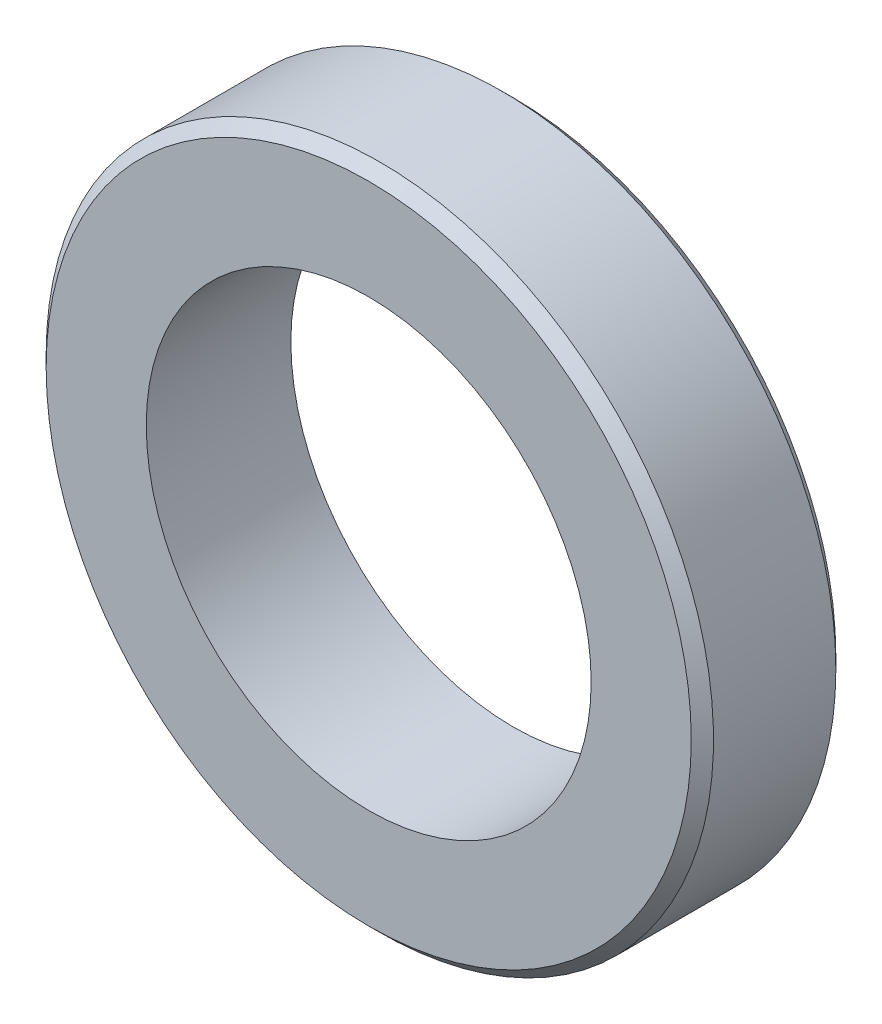
ISO-10303-21;
HEADER;
FILE_DESCRIPTION(('STEP AP214'),'2;1');
FILE_NAME('part.step','',(''),(''),'','','');
FILE_SCHEMA(('AUTOMOTIVE_DESIGN { 1 0 10303 214 1 1 1 1 }'));
ENDSEC;
DATA;
#1=APPLICATION_CONTEXT('core data for automotive mechanical design processes');
#2=APPLICATION_PROTOCOL_DEFINITION('international standard','automotive_design',2000,#1);
#3=PRODUCT_CONTEXT('',#1,'mechanical');
#4=PRODUCT('Part','Part','',(#3));
#5=PRODUCT_RELATED_PRODUCT_CATEGORY('part','',(#4));
#6=PRODUCT_DEFINITION_FORMATION('','',#4);
#7=PRODUCT_DEFINITION_CONTEXT('part definition',#1,'design');
#8=PRODUCT_DEFINITION('design','',#6,#7);
#9=PRODUCT_DEFINITION_SHAPE('','',#8);
#10=(LENGTH_UNIT() NAMED_UNIT(*) SI_UNIT(.MILLI.,.METRE.));
#11=(NAMED_UNIT(*) PLANE_ANGLE_UNIT() SI_UNIT($,.RADIAN.));
#12=(NAMED_UNIT(*) SI_UNIT($,.STERADIAN.) SOLID_ANGLE_UNIT());
#13=UNCERTAINTY_MEASURE_WITH_UNIT(LENGTH_MEASURE(1.E-05),#10,'distance_accuracy_value','');
#14=(GEOMETRIC_REPRESENTATION_CONTEXT(3) GLOBAL_UNCERTAINTY_ASSIGNED_CONTEXT((#13)) GLOBAL_UNIT_ASSIGNED_CONTEXT((#10,
#11,#12)) REPRESENTATION_CONTEXT('',''));
#15=CARTESIAN_POINT('',(0.,0.,0.));
#16=DIRECTION('',(0.,0.,1.));
#17=DIRECTION('',(1.,0.,0.));
#18=AXIS2_PLACEMENT_3D('',#15,#16,#17);
#19=CARTESIAN_POINT('',(0.,0.,13.));
#20=DIRECTION('',(0.,0.,1.));
#21=DIRECTION('',(1.,0.,0.));
#22=AXIS2_PLACEMENT_3D('',#19,#20,#21);
#23=PLANE('',#22);
#24=CARTESIAN_POINT('',(0.,0.,13.));
#25=DIRECTION('',(0.,0.,1.));
#26=DIRECTION('',(1.,0.,0.));
#27=AXIS2_PLACEMENT_3D('',#24,#25,#26);
#28=CIRCLE('',#27,29.);
#29=CARTESIAN_POINT('',(29.,0.,13.));
#30=VERTEX_POINT('',#29);
#31=EDGE_CURVE('E55',#30,#30,#28,.T.);
#32=ORIENTED_EDGE('',*,*,#31,.T.);
#33=EDGE_LOOP('',(#32));
#34=FACE_BOUND('',#33,.T.);
#35=CARTESIAN_POINT('',(0.,0.,13.));
#36=DIRECTION('',(0.,0.,1.));
#37=DIRECTION('',(1.,0.,0.));
#38=AXIS2_PLACEMENT_3D('',#35,#36,#37);
#39=CIRCLE('',#38,20.);
#40=CARTESIAN_POINT('',(-20.,0.,13.));
#41=VERTEX_POINT('',#40);
#42=EDGE_CURVE('E60',#41,#41,#39,.T.);
#43=ORIENTED_EDGE('',*,*,#42,.F.);
#44=EDGE_LOOP('',(#43));
#45=FACE_BOUND('',#44,.T.);
#46=ADVANCED_FACE('F39',(#34,#45),#23,.T.);
#47=CARTESIAN_POINT('',(0.,0.,0.));
#48=DIRECTION('',(0.,0.,1.));
#49=DIRECTION('',(1.,0.,0.));
#50=AXIS2_PLACEMENT_3D('',#47,#48,#49);
#51=PLANE('',#50);
#52=CARTESIAN_POINT('',(0.,0.,0.));
#53=DIRECTION('',(0.,0.,1.));
#54=DIRECTION('',(1.,0.,0.));
#55=AXIS2_PLACEMENT_3D('',#52,#53,#54);
#56=CIRCLE('',#55,29.);
#57=CARTESIAN_POINT('',(29.,0.,0.));
#58=VERTEX_POINT('',#57);
#59=EDGE_CURVE('E10',#58,#58,#56,.F.);
#60=ORIENTED_EDGE('',*,*,#59,.T.);
#61=EDGE_LOOP('',(#60));
#62=FACE_BOUND('',#61,.T.);
#63=CARTESIAN_POINT('',(0.,0.,0.));
#64=DIRECTION('',(0.,0.,1.));
#65=DIRECTION('',(1.,0.,0.));
#66=AXIS2_PLACEMENT_3D('',#63,#64,#65);
#67=CIRCLE('',#66,20.);
#68=CARTESIAN_POINT('',(-20.,0.,0.));
#69=VERTEX_POINT('',#68);
#70=EDGE_CURVE('E61',#69,#69,#67,.T.);
#71=ORIENTED_EDGE('',*,*,#70,.T.);
#72=EDGE_LOOP('',(#71));
#73=FACE_BOUND('',#72,.T.);
#74=ADVANCED_FACE('F71',(#62,#73),#51,.F.);
#75=CARTESIAN_POINT('',(0.,0.,13.));
#76=DIRECTION('',(0.,0.,-1.));
#77=DIRECTION('',(-1.,0.,0.));
#78=AXIS2_PLACEMENT_3D('',#75,#76,#77);
#79=CYLINDRICAL_SURFACE('',#78,30.);
#80=CARTESIAN_POINT('',(0.,0.,12.));
#81=DIRECTION('',(0.,0.,1.));
#82=DIRECTION('',(1.,0.,0.));
#83=AXIS2_PLACEMENT_3D('',#80,#81,#82);
#84=CIRCLE('',#83,30.);
#85=CARTESIAN_POINT('',(-30.,0.,12.));
#86=VERTEX_POINT('',#85);
#87=EDGE_CURVE('E47',#86,#86,#84,.F.);
#88=CARTESIAN_POINT('',(0.,0.,1.00000000000003));
#89=DIRECTION('',(0.,0.,1.));
#90=DIRECTION('',(1.,0.,0.));
#91=AXIS2_PLACEMENT_3D('',#88,#89,#90);
#92=CIRCLE('',#91,30.);
#93=CARTESIAN_POINT('',(-30.,0.,1.00000000000003));
#94=VERTEX_POINT('',#93);
#95=EDGE_CURVE('E51',#94,#94,#92,.T.);
#96=CARTESIAN_POINT('',(-30.,0.,12.));
#97=CARTESIAN_POINT('',(-30.,0.,11.8854166666667));
#98=CARTESIAN_POINT('',(-30.,0.,11.7708333333334));
#99=CARTESIAN_POINT('',(-30.,0.,11.5416666666667));
#100=CARTESIAN_POINT('',(-30.,0.,11.4270833333334));
#101=CARTESIAN_POINT('',(-30.,0.,11.1979166666667));
#102=CARTESIAN_POINT('',(-30.,0.,11.0833333333334));
#103=CARTESIAN_POINT('',(-30.,0.,10.8541666666667));
#104=CARTESIAN_POINT('',(-30.,0.,10.7395833333334));
#105=CARTESIAN_POINT('',(-30.,0.,10.5104166666667));
#106=CARTESIAN_POINT('',(-30.,0.,10.3958333333334));
#107=CARTESIAN_POINT('',(-30.,0.,10.1666666666667));
#108=CARTESIAN_POINT('',(-30.,0.,10.0520833333334));
#109=CARTESIAN_POINT('',(-30.,0.,9.8229166666667));
#110=CARTESIAN_POINT('',(-30.,0.,9.70833333333336));
#111=CARTESIAN_POINT('',(-30.,0.,9.4791666666667));
#112=CARTESIAN_POINT('',(-30.,0.,9.36458333333336));
#113=CARTESIAN_POINT('',(-30.,0.,9.1354166666667));
#114=CARTESIAN_POINT('',(-30.,0.,9.02083333333336));
#115=CARTESIAN_POINT('',(-30.,0.,8.7916666666667));
#116=CARTESIAN_POINT('',(-30.,0.,8.67708333333336));
#117=CARTESIAN_POINT('',(-30.,0.,8.4479166666667));
#118=CARTESIAN_POINT('',(-30.,0.,8.33333333333336));
#119=CARTESIAN_POINT('',(-30.,0.,8.1041666666667));
#120=CARTESIAN_POINT('',(-30.,0.,7.98958333333336));
#121=CARTESIAN_POINT('',(-30.,0.,7.7604166666667));
#122=CARTESIAN_POINT('',(-30.,0.,7.64583333333336));
#123=CARTESIAN_POINT('',(-30.,0.,7.4166666666667));
#124=CARTESIAN_POINT('',(-30.,0.,7.30208333333336));
#125=CARTESIAN_POINT('',(-30.,0.,7.0729166666667));
#126=CARTESIAN_POINT('',(-30.,0.,6.95833333333336));
#127=CARTESIAN_POINT('',(-30.,0.,6.72916666666669));
#128=CARTESIAN_POINT('',(-30.,0.,6.61458333333336));
#129=CARTESIAN_POINT('',(-30.,0.,6.38541666666669));
#130=CARTESIAN_POINT('',(-30.,0.,6.27083333333336));
#131=CARTESIAN_POINT('',(-30.,0.,6.04166666666669));
#132=CARTESIAN_POINT('',(-30.,0.,5.92708333333336));
#133=CARTESIAN_POINT('',(-30.,0.,5.69791666666669));
#134=CARTESIAN_POINT('',(-30.,0.,5.58333333333336));
#135=CARTESIAN_POINT('',(-30.,0.,5.35416666666669));
#136=CARTESIAN_POINT('',(-30.,0.,5.23958333333336));
#137=CARTESIAN_POINT('',(-30.,0.,5.0104166666667));
#138=CARTESIAN_POINT('',(-30.,0.,4.89583333333336));
#139=CARTESIAN_POINT('',(-30.,0.,4.66666666666669));
#140=CARTESIAN_POINT('',(-30.,0.,4.55208333333336));
#141=CARTESIAN_POINT('',(-30.,0.,4.32291666666669));
#142=CARTESIAN_POINT('',(-30.,0.,4.20833333333336));
#143=CARTESIAN_POINT('',(-30.,0.,3.97916666666669));
#144=CARTESIAN_POINT('',(-30.,0.,3.86458333333336));
#145=CARTESIAN_POINT('',(-30.,0.,3.63541666666669));
#146=CARTESIAN_POINT('',(-30.,0.,3.52083333333336));
#147=CARTESIAN_POINT('',(-30.,0.,3.29166666666669));
#148=CARTESIAN_POINT('',(-30.,0.,3.17708333333336));
#149=CARTESIAN_POINT('',(-30.,0.,2.94791666666669));
#150=CARTESIAN_POINT('',(-30.,0.,2.83333333333336));
#151=CARTESIAN_POINT('',(-30.,0.,2.60416666666669));
#152=CARTESIAN_POINT('',(-30.,0.,2.48958333333336));
#153=CARTESIAN_POINT('',(-30.,0.,2.26041666666669));
#154=CARTESIAN_POINT('',(-30.,0.,2.14583333333336));
#155=CARTESIAN_POINT('',(-30.,0.,1.91666666666669));
#156=CARTESIAN_POINT('',(-30.,0.,1.80208333333336));
#157=CARTESIAN_POINT('',(-30.,0.,1.57291666666669));
#158=CARTESIAN_POINT('',(-30.,0.,1.45833333333336));
#159=CARTESIAN_POINT('',(-30.,0.,1.22916666666669));
#160=CARTESIAN_POINT('',(-30.,0.,1.11458333333336));
#161=CARTESIAN_POINT('',(-30.,0.,1.00000000000003));
#162=B_SPLINE_CURVE_WITH_KNOTS('',3,(#96,#97,#98,#99,#100,#101,#102,#103,#104,#105,#106,#107,
#108,#109,#110,#111,#112,#113,#114,#115,#116,#117,#118,#119,#120,#121,#122,#123,#124,#125,#126,
#127,#128,#129,#130,#131,#132,#133,#134,#135,#136,#137,#138,#139,#140,#141,#142,#143,#144,#145,
#146,#147,#148,#149,#150,#151,#152,#153,#154,#155,#156,#157,#158,#159,#160,#161),.UNSPECIFIED.,
.F.,.F.,(4,2,2,2,2,2,2,2,2,2,2,2,2,2,2,2,2,2,2,2,2,2,2,2,2,2,2,2,2,2,2,2,4),(0.,0.34375,
0.687500000000001,1.03125,1.375,1.71875,2.0625,2.40625,2.75,3.09375,3.4375,3.78125,4.125,
4.46875,4.8125,5.15625,5.50000000000001,5.84375000000001,6.18750000000001,6.53125000000001,
6.875,7.21875,7.56250000000001,7.90625000000001,8.25000000000001,8.59375000000001,
8.93750000000001,9.28125000000001,9.62500000000001,9.96875000000001,10.3125,10.65625,11.),.UNSPECIFIED.);
#163=EDGE_CURVE('BSEAM78',#86,#94,#162,.T.);
#164=ORIENTED_EDGE('',*,*,#87,.T.);
#165=ORIENTED_EDGE('',*,*,#95,.T.);
#166=ORIENTED_EDGE('',*,*,#163,.T.);
#167=ORIENTED_EDGE('',*,*,#163,.F.);
#168=EDGE_LOOP('',(#164,#166,#165,#167));
#169=FACE_BOUND('',#168,.T.);
#170=ADVANCED_FACE('F78',(#169),#79,.T.);
#171=CARTESIAN_POINT('',(0.,0.,13.));
#172=DIRECTION('',(0.,0.,-1.));
#173=DIRECTION('',(-1.,0.,0.));
#174=AXIS2_PLACEMENT_3D('',#171,#172,#173);
#175=CYLINDRICAL_SURFACE('',#174,20.);
#176=CARTESIAN_POINT('',(-20.,0.,13.));
#177=CARTESIAN_POINT('',(-20.,0.,12.8645833333333));
#178=CARTESIAN_POINT('',(-20.,0.,12.7291666666667));
#179=CARTESIAN_POINT('',(-20.,0.,12.4583333333333));
#180=CARTESIAN_POINT('',(-20.,0.,12.3229166666667));
#181=CARTESIAN_POINT('',(-20.,0.,12.0520833333333));
#182=CARTESIAN_POINT('',(-20.,0.,11.9166666666667));
#183=CARTESIAN_POINT('',(-20.,0.,11.6458333333333));
#184=CARTESIAN_POINT('',(-20.,0.,11.5104166666667));
#185=CARTESIAN_POINT('',(-20.,0.,11.2395833333333));
#186=CARTESIAN_POINT('',(-20.,0.,11.1041666666667));
#187=CARTESIAN_POINT('',(-20.,0.,10.8333333333333));
#188=CARTESIAN_POINT('',(-20.,0.,10.6979166666667));
#189=CARTESIAN_POINT('',(-20.,0.,10.4270833333333));
#190=CARTESIAN_POINT('',(-20.,0.,10.2916666666667));
#191=CARTESIAN_POINT('',(-20.,0.,10.0208333333333));
#192=CARTESIAN_POINT('',(-20.,0.,9.88541666666667));
#193=CARTESIAN_POINT('',(-20.,0.,9.61458333333333));
#194=CARTESIAN_POINT('',(-20.,0.,9.47916666666667));
#195=CARTESIAN_POINT('',(-20.,0.,9.20833333333333));
#196=CARTESIAN_POINT('',(-20.,0.,9.07291666666666));
#197=CARTESIAN_POINT('',(-20.,0.,8.80208333333333));
#198=CARTESIAN_POINT('',(-20.,0.,8.66666666666667));
#199=CARTESIAN_POINT('',(-20.,0.,8.39583333333333));
#200=CARTESIAN_POINT('',(-20.,0.,8.26041666666667));
#201=CARTESIAN_POINT('',(-20.,0.,7.98958333333333));
#202=CARTESIAN_POINT('',(-20.,0.,7.85416666666667));
#203=CARTESIAN_POINT('',(-20.,0.,7.58333333333333));
#204=CARTESIAN_POINT('',(-20.,0.,7.44791666666667));
#205=CARTESIAN_POINT('',(-20.,0.,7.17708333333333));
#206=CARTESIAN_POINT('',(-20.,0.,7.04166666666667));
#207=CARTESIAN_POINT('',(-20.,0.,6.77083333333333));
#208=CARTESIAN_POINT('',(-20.,0.,6.63541666666667));
#209=CARTESIAN_POINT('',(-20.,0.,6.36458333333333));
#210=CARTESIAN_POINT('',(-20.,0.,6.22916666666667));
#211=CARTESIAN_POINT('',(-20.,0.,5.95833333333333));
#212=CARTESIAN_POINT('',(-20.,0.,5.82291666666667));
#213=CARTESIAN_POINT('',(-20.,0.,5.55208333333333));
#214=CARTESIAN_POINT('',(-20.,0.,5.41666666666667));
#215=CARTESIAN_POINT('',(-20.,0.,5.14583333333333));
#216=CARTESIAN_POINT('',(-20.,0.,5.01041666666667));
#217=CARTESIAN_POINT('',(-20.,0.,4.73958333333333));
#218=CARTESIAN_POINT('',(-20.,0.,4.60416666666667));
#219=CARTESIAN_POINT('',(-20.,0.,4.33333333333333));
#220=CARTESIAN_POINT('',(-20.,0.,4.19791666666667));
#221=CARTESIAN_POINT('',(-20.,0.,3.92708333333333));
#222=CARTESIAN_POINT('',(-20.,0.,3.79166666666667));
#223=CARTESIAN_POINT('',(-20.,0.,3.52083333333333));
#224=CARTESIAN_POINT('',(-20.,0.,3.38541666666667));
#225=CARTESIAN_POINT('',(-20.,0.,3.11458333333333));
#226=CARTESIAN_POINT('',(-20.,0.,2.97916666666667));
#227=CARTESIAN_POINT('',(-20.,0.,2.70833333333333));
#228=CARTESIAN_POINT('',(-20.,0.,2.57291666666667));
#229=CARTESIAN_POINT('',(-20.,0.,2.30208333333333));
#230=CARTESIAN_POINT('',(-20.,0.,2.16666666666667));
#231=CARTESIAN_POINT('',(-20.,0.,1.89583333333333));
#232=CARTESIAN_POINT('',(-20.,0.,1.76041666666667));
#233=CARTESIAN_POINT('',(-20.,0.,1.48958333333333));
#234=CARTESIAN_POINT('',(-20.,0.,1.35416666666667));
#235=CARTESIAN_POINT('',(-20.,0.,1.08333333333333));
#236=CARTESIAN_POINT('',(-20.,0.,0.947916666666667));
#237=CARTESIAN_POINT('',(-20.,0.,0.677083333333334));
#238=CARTESIAN_POINT('',(-20.,0.,0.541666666666667));
#239=CARTESIAN_POINT('',(-20.,0.,0.270833333333334));
#240=CARTESIAN_POINT('',(-20.,0.,0.135416666666667));
#241=CARTESIAN_POINT('',(-20.,0.,0.));
#242=B_SPLINE_CURVE_WITH_KNOTS('',3,(#176,#177,#178,#179,#180,#181,#182,#183,#184,#185,#186,
#187,#188,#189,#190,#191,#192,#193,#194,#195,#196,#197,#198,#199,#200,#201,#202,#203,#204,#205,
#206,#207,#208,#209,#210,#211,#212,#213,#214,#215,#216,#217,#218,#219,#220,#221,#222,#223,#224,
#225,#226,#227,#228,#229,#230,#231,#232,#233,#234,#235,#236,#237,#238,#239,#240,#241),
.UNSPECIFIED.,.F.,.F.,(4,2,2,2,2,2,2,2,2,2,2,2,2,2,2,2,2,2,2,2,2,2,2,2,2,2,2,2,2,2,2,2,4),(0.,
0.40625,0.812500000000001,1.21875,1.625,2.03125,2.4375,2.84375,3.25,3.65625,4.0625,4.46875,
4.875,5.28125,5.6875,6.09375,6.5,6.90625,7.3125,7.71875,8.125,8.53125,8.9375,9.34375,9.75,
10.15625,10.5625,10.96875,11.375,11.78125,12.1875,12.59375,13.),.UNSPECIFIED.);
#243=EDGE_CURVE('BSEAM67',#41,#69,#242,.T.);
#244=ORIENTED_EDGE('',*,*,#42,.T.);
#245=ORIENTED_EDGE('',*,*,#70,.F.);
#246=ORIENTED_EDGE('',*,*,#243,.T.);
#247=ORIENTED_EDGE('',*,*,#243,.F.);
#248=EDGE_LOOP('',(#244,#246,#245,#247));
#249=FACE_BOUND('',#248,.T.);
#250=ADVANCED_FACE('F67',(#249),#175,.F.);
#251=CARTESIAN_POINT('',(0.,0.,13.));
#252=DIRECTION('',(0.,0.,-1.));
#253=DIRECTION('',(-1.,0.,0.));
#254=AXIS2_PLACEMENT_3D('',#251,#252,#253);
#255=CONICAL_SURFACE('',#254,29.,0.785398163397445);
#256=ORIENTED_EDGE('',*,*,#87,.F.);
#257=EDGE_LOOP('',(#256));
#258=FACE_BOUND('',#257,.T.);
#259=ORIENTED_EDGE('',*,*,#31,.F.);
#260=EDGE_LOOP('',(#259));
#261=FACE_BOUND('',#260,.T.);
#262=ADVANCED_FACE('F84',(#258,#261),#255,.T.);
#263=CARTESIAN_POINT('',(0.,0.,1.00000000000003));
#264=DIRECTION('',(0.,0.,1.));
#265=DIRECTION('',(1.,0.,0.));
#266=AXIS2_PLACEMENT_3D('',#263,#264,#265);
#267=CONICAL_SURFACE('',#266,30.,0.785398163397452);
#268=ORIENTED_EDGE('',*,*,#59,.F.);
#269=EDGE_LOOP('',(#268));
#270=FACE_BOUND('',#269,.T.);
#271=ORIENTED_EDGE('',*,*,#95,.F.);
#272=EDGE_LOOP('',(#271));
#273=FACE_BOUND('',#272,.T.);
#274=ADVANCED_FACE('F42',(#270,#273),#267,.T.);
#275=CLOSED_SHELL('',(#46,#74,#170,#250,#262,#274));
#276=MANIFOLD_SOLID_BREP('B2',#275);
#277=ADVANCED_BREP_SHAPE_REPRESENTATION('',(#18,#276),#14);
#278=SHAPE_DEFINITION_REPRESENTATION(#9,#277);
ENDSEC;
END-ISO-10303-21;
